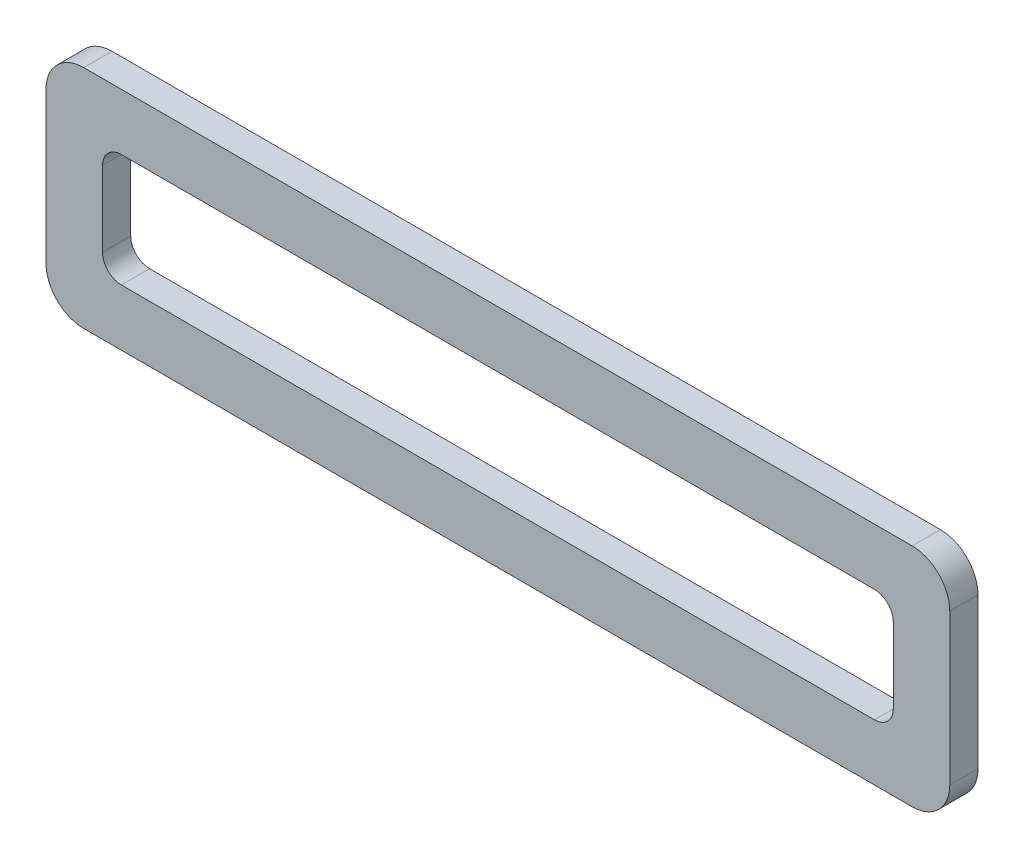
ISO-10303-21;
HEADER;
FILE_DESCRIPTION(('STEP AP214'),'2;1');
FILE_NAME('part.step','',(''),(''),'','','');
FILE_SCHEMA(('AUTOMOTIVE_DESIGN { 1 0 10303 214 1 1 1 1 }'));
ENDSEC;
DATA;
#1=APPLICATION_CONTEXT('core data for automotive mechanical design processes');
#2=APPLICATION_PROTOCOL_DEFINITION('international standard','automotive_design',2000,#1);
#3=PRODUCT_CONTEXT('',#1,'mechanical');
#4=PRODUCT('Part','Part','',(#3));
#5=PRODUCT_RELATED_PRODUCT_CATEGORY('part','',(#4));
#6=PRODUCT_DEFINITION_FORMATION('','',#4);
#7=PRODUCT_DEFINITION_CONTEXT('part definition',#1,'design');
#8=PRODUCT_DEFINITION('design','',#6,#7);
#9=PRODUCT_DEFINITION_SHAPE('','',#8);
#10=(LENGTH_UNIT() NAMED_UNIT(*) SI_UNIT(.MILLI.,.METRE.));
#11=(NAMED_UNIT(*) PLANE_ANGLE_UNIT() SI_UNIT($,.RADIAN.));
#12=(NAMED_UNIT(*) SI_UNIT($,.STERADIAN.) SOLID_ANGLE_UNIT());
#13=UNCERTAINTY_MEASURE_WITH_UNIT(LENGTH_MEASURE(1.E-05),#10,'distance_accuracy_value','');
#14=(GEOMETRIC_REPRESENTATION_CONTEXT(3) GLOBAL_UNCERTAINTY_ASSIGNED_CONTEXT((#13)) GLOBAL_UNIT_ASSIGNED_CONTEXT((#10,
#11,#12)) REPRESENTATION_CONTEXT('',''));
#15=CARTESIAN_POINT('',(0.,0.,0.));
#16=DIRECTION('',(0.,0.,1.));
#17=DIRECTION('',(1.,0.,0.));
#18=AXIS2_PLACEMENT_3D('',#15,#16,#17);
#19=CARTESIAN_POINT('',(0.,0.,9.525));
#20=DIRECTION('',(0.,0.,1.));
#21=DIRECTION('',(1.,0.,0.));
#22=AXIS2_PLACEMENT_3D('',#19,#20,#21);
#23=PLANE('',#22);
#24=DIRECTION('',(0.,-1.,0.));
#25=VECTOR('',#24,1.);
#26=CARTESIAN_POINT('',(-152.4,38.1,9.525));
#27=LINE('',#26,#25);
#28=CARTESIAN_POINT('',(-152.4,25.4,9.525));
#29=VERTEX_POINT('',#28);
#30=CARTESIAN_POINT('',(-152.4,-25.4,9.525));
#31=VERTEX_POINT('',#30);
#32=EDGE_CURVE('E278',#29,#31,#27,.T.);
#33=ORIENTED_EDGE('',*,*,#32,.T.);
#34=CARTESIAN_POINT('',(-139.7,-25.4,9.525));
#35=DIRECTION('',(0.,0.,1.));
#36=DIRECTION('',(1.,0.,0.));
#37=AXIS2_PLACEMENT_3D('',#34,#35,#36);
#38=CIRCLE('',#37,12.7);
#39=CARTESIAN_POINT('',(-139.7,-38.1,9.525));
#40=VERTEX_POINT('',#39);
#41=EDGE_CURVE('E199',#31,#40,#38,.T.);
#42=ORIENTED_EDGE('',*,*,#41,.T.);
#43=DIRECTION('',(1.,0.,0.));
#44=VECTOR('',#43,1.);
#45=CARTESIAN_POINT('',(-152.4,-38.1,9.525));
#46=LINE('',#45,#44);
#47=CARTESIAN_POINT('',(139.7,-38.1,9.525));
#48=VERTEX_POINT('',#47);
#49=EDGE_CURVE('E168',#40,#48,#46,.T.);
#50=ORIENTED_EDGE('',*,*,#49,.T.);
#51=CARTESIAN_POINT('',(139.7,-25.4,9.525));
#52=DIRECTION('',(0.,0.,1.));
#53=DIRECTION('',(1.,0.,0.));
#54=AXIS2_PLACEMENT_3D('',#51,#52,#53);
#55=CIRCLE('',#54,12.7);
#56=CARTESIAN_POINT('',(152.4,-25.4,9.525));
#57=VERTEX_POINT('',#56);
#58=EDGE_CURVE('E197',#48,#57,#55,.T.);
#59=ORIENTED_EDGE('',*,*,#58,.T.);
#60=DIRECTION('',(0.,1.,0.));
#61=VECTOR('',#60,1.);
#62=CARTESIAN_POINT('',(152.4,38.1,9.525));
#63=LINE('',#62,#61);
#64=CARTESIAN_POINT('',(152.4,25.4,9.525));
#65=VERTEX_POINT('',#64);
#66=EDGE_CURVE('E175',#57,#65,#63,.T.);
#67=ORIENTED_EDGE('',*,*,#66,.T.);
#68=CARTESIAN_POINT('',(139.7,25.4,9.525));
#69=DIRECTION('',(0.,0.,1.));
#70=DIRECTION('',(1.,0.,0.));
#71=AXIS2_PLACEMENT_3D('',#68,#69,#70);
#72=CIRCLE('',#71,12.7);
#73=CARTESIAN_POINT('',(139.7,38.1,9.525));
#74=VERTEX_POINT('',#73);
#75=EDGE_CURVE('E195',#65,#74,#72,.T.);
#76=ORIENTED_EDGE('',*,*,#75,.T.);
#77=DIRECTION('',(-1.,0.,0.));
#78=VECTOR('',#77,1.);
#79=CARTESIAN_POINT('',(-152.4,38.1,9.525));
#80=LINE('',#79,#78);
#81=CARTESIAN_POINT('',(-139.7,38.1,9.525));
#82=VERTEX_POINT('',#81);
#83=EDGE_CURVE('E179',#74,#82,#80,.T.);
#84=ORIENTED_EDGE('',*,*,#83,.T.);
#85=CARTESIAN_POINT('',(-139.7,25.4,9.525));
#86=DIRECTION('',(0.,0.,1.));
#87=DIRECTION('',(1.,0.,0.));
#88=AXIS2_PLACEMENT_3D('',#85,#86,#87);
#89=CIRCLE('',#88,12.7);
#90=EDGE_CURVE('E193',#82,#29,#89,.T.);
#91=ORIENTED_EDGE('',*,*,#90,.T.);
#92=EDGE_LOOP('',(#33,#42,#50,#59,#67,#76,#84,#91));
#93=FACE_BOUND('',#92,.T.);
#94=DIRECTION('',(-1.,0.,0.));
#95=VECTOR('',#94,1.);
#96=CARTESIAN_POINT('',(-133.35,19.05,9.525));
#97=LINE('',#96,#95);
#98=CARTESIAN_POINT('',(127.,19.05,9.525));
#99=VERTEX_POINT('',#98);
#100=CARTESIAN_POINT('',(-127.,19.05,9.525));
#101=VERTEX_POINT('',#100);
#102=EDGE_CURVE('E255',#99,#101,#97,.T.);
#103=ORIENTED_EDGE('',*,*,#102,.F.);
#104=CARTESIAN_POINT('',(127.,12.7,9.525));
#105=DIRECTION('',(0.,0.,1.));
#106=DIRECTION('',(1.,0.,0.));
#107=AXIS2_PLACEMENT_3D('',#104,#105,#106);
#108=CIRCLE('',#107,6.35);
#109=CARTESIAN_POINT('',(133.35,12.7,9.525));
#110=VERTEX_POINT('',#109);
#111=EDGE_CURVE('E232',#99,#110,#108,.F.);
#112=ORIENTED_EDGE('',*,*,#111,.T.);
#113=DIRECTION('',(0.,1.,0.));
#114=VECTOR('',#113,1.);
#115=CARTESIAN_POINT('',(133.35,19.05,9.525));
#116=LINE('',#115,#114);
#117=CARTESIAN_POINT('',(133.35,-12.7,9.525));
#118=VERTEX_POINT('',#117);
#119=EDGE_CURVE('E261',#118,#110,#116,.T.);
#120=ORIENTED_EDGE('',*,*,#119,.F.);
#121=CARTESIAN_POINT('',(127.,-12.7,9.525));
#122=DIRECTION('',(0.,0.,1.));
#123=DIRECTION('',(1.,0.,0.));
#124=AXIS2_PLACEMENT_3D('',#121,#122,#123);
#125=CIRCLE('',#124,6.35);
#126=CARTESIAN_POINT('',(127.,-19.05,9.525));
#127=VERTEX_POINT('',#126);
#128=EDGE_CURVE('E236',#118,#127,#125,.F.);
#129=ORIENTED_EDGE('',*,*,#128,.T.);
#130=DIRECTION('',(1.,0.,0.));
#131=VECTOR('',#130,1.);
#132=CARTESIAN_POINT('',(-133.35,-19.05,9.525));
#133=LINE('',#132,#131);
#134=CARTESIAN_POINT('',(-127.,-19.05,9.525));
#135=VERTEX_POINT('',#134);
#136=EDGE_CURVE('E263',#135,#127,#133,.T.);
#137=ORIENTED_EDGE('',*,*,#136,.F.);
#138=CARTESIAN_POINT('',(-127.,-12.7,9.525));
#139=DIRECTION('',(0.,0.,1.));
#140=DIRECTION('',(1.,0.,0.));
#141=AXIS2_PLACEMENT_3D('',#138,#139,#140);
#142=CIRCLE('',#141,6.35);
#143=CARTESIAN_POINT('',(-133.35,-12.7,9.525));
#144=VERTEX_POINT('',#143);
#145=EDGE_CURVE('E49',#135,#144,#142,.F.);
#146=ORIENTED_EDGE('',*,*,#145,.T.);
#147=DIRECTION('',(0.,-1.,0.));
#148=VECTOR('',#147,1.);
#149=CARTESIAN_POINT('',(-133.35,19.05,9.525));
#150=LINE('',#149,#148);
#151=CARTESIAN_POINT('',(-133.35,12.7,9.525));
#152=VERTEX_POINT('',#151);
#153=EDGE_CURVE('E257',#152,#144,#150,.T.);
#154=ORIENTED_EDGE('',*,*,#153,.F.);
#155=CARTESIAN_POINT('',(-127.,12.7,9.525));
#156=DIRECTION('',(0.,0.,1.));
#157=DIRECTION('',(1.,0.,0.));
#158=AXIS2_PLACEMENT_3D('',#155,#156,#157);
#159=CIRCLE('',#158,6.35);
#160=EDGE_CURVE('E11',#152,#101,#159,.F.);
#161=ORIENTED_EDGE('',*,*,#160,.T.);
#162=EDGE_LOOP('',(#103,#112,#120,#129,#137,#146,#154,#161));
#163=FACE_BOUND('',#162,.T.);
#164=ADVANCED_FACE('F34',(#93,#163),#23,.T.);
#165=CARTESIAN_POINT('',(0.,0.,0.));
#166=DIRECTION('',(0.,0.,1.));
#167=DIRECTION('',(1.,0.,0.));
#168=AXIS2_PLACEMENT_3D('',#165,#166,#167);
#169=PLANE('',#168);
#170=DIRECTION('',(1.,0.,0.));
#171=VECTOR('',#170,1.);
#172=CARTESIAN_POINT('',(-152.4,-38.1,0.));
#173=LINE('',#172,#171);
#174=CARTESIAN_POINT('',(-139.7,-38.1,0.));
#175=VERTEX_POINT('',#174);
#176=CARTESIAN_POINT('',(139.7,-38.1,0.));
#177=VERTEX_POINT('',#176);
#178=EDGE_CURVE('E165',#175,#177,#173,.T.);
#179=ORIENTED_EDGE('',*,*,#178,.F.);
#180=CARTESIAN_POINT('',(-139.7,-25.4,0.));
#181=DIRECTION('',(0.,0.,1.));
#182=DIRECTION('',(1.,0.,0.));
#183=AXIS2_PLACEMENT_3D('',#180,#181,#182);
#184=CIRCLE('',#183,12.7);
#185=CARTESIAN_POINT('',(-152.4,-25.4,0.));
#186=VERTEX_POINT('',#185);
#187=EDGE_CURVE('E148',#175,#186,#184,.F.);
#188=ORIENTED_EDGE('',*,*,#187,.T.);
#189=DIRECTION('',(0.,-1.,0.));
#190=VECTOR('',#189,1.);
#191=CARTESIAN_POINT('',(-152.4,38.1,0.));
#192=LINE('',#191,#190);
#193=CARTESIAN_POINT('',(-152.4,25.4,0.));
#194=VERTEX_POINT('',#193);
#195=EDGE_CURVE('E176',#194,#186,#192,.T.);
#196=ORIENTED_EDGE('',*,*,#195,.F.);
#197=CARTESIAN_POINT('',(-139.7,25.4,0.));
#198=DIRECTION('',(0.,0.,1.));
#199=DIRECTION('',(1.,0.,0.));
#200=AXIS2_PLACEMENT_3D('',#197,#198,#199);
#201=CIRCLE('',#200,12.7);
#202=CARTESIAN_POINT('',(-139.7,38.1,0.));
#203=VERTEX_POINT('',#202);
#204=EDGE_CURVE('E169',#194,#203,#201,.F.);
#205=ORIENTED_EDGE('',*,*,#204,.T.);
#206=DIRECTION('',(-1.,0.,0.));
#207=VECTOR('',#206,1.);
#208=CARTESIAN_POINT('',(-152.4,38.1,0.));
#209=LINE('',#208,#207);
#210=CARTESIAN_POINT('',(139.7,38.1,0.));
#211=VERTEX_POINT('',#210);
#212=EDGE_CURVE('E181',#211,#203,#209,.T.);
#213=ORIENTED_EDGE('',*,*,#212,.F.);
#214=CARTESIAN_POINT('',(139.7,25.4,0.));
#215=DIRECTION('',(0.,0.,1.));
#216=DIRECTION('',(1.,0.,0.));
#217=AXIS2_PLACEMENT_3D('',#214,#215,#216);
#218=CIRCLE('',#217,12.7);
#219=CARTESIAN_POINT('',(152.4,25.4,0.));
#220=VERTEX_POINT('',#219);
#221=EDGE_CURVE('E187',#211,#220,#218,.F.);
#222=ORIENTED_EDGE('',*,*,#221,.T.);
#223=DIRECTION('',(0.,1.,0.));
#224=VECTOR('',#223,1.);
#225=CARTESIAN_POINT('',(152.4,38.1,0.));
#226=LINE('',#225,#224);
#227=CARTESIAN_POINT('',(152.4,-25.4,0.));
#228=VERTEX_POINT('',#227);
#229=EDGE_CURVE('E270',#228,#220,#226,.T.);
#230=ORIENTED_EDGE('',*,*,#229,.F.);
#231=CARTESIAN_POINT('',(139.7,-25.4,0.));
#232=DIRECTION('',(0.,0.,1.));
#233=DIRECTION('',(1.,0.,0.));
#234=AXIS2_PLACEMENT_3D('',#231,#232,#233);
#235=CIRCLE('',#234,12.7);
#236=EDGE_CURVE('E159',#228,#177,#235,.F.);
#237=ORIENTED_EDGE('',*,*,#236,.T.);
#238=EDGE_LOOP('',(#179,#188,#196,#205,#213,#222,#230,#237));
#239=FACE_BOUND('',#238,.T.);
#240=DIRECTION('',(1.,0.,0.));
#241=VECTOR('',#240,1.);
#242=CARTESIAN_POINT('',(-133.35,-19.05,0.));
#243=LINE('',#242,#241);
#244=CARTESIAN_POINT('',(-127.,-19.05,0.));
#245=VERTEX_POINT('',#244);
#246=CARTESIAN_POINT('',(127.,-19.05,0.));
#247=VERTEX_POINT('',#246);
#248=EDGE_CURVE('E250',#245,#247,#243,.T.);
#249=ORIENTED_EDGE('',*,*,#248,.T.);
#250=CARTESIAN_POINT('',(127.,-12.7,0.));
#251=DIRECTION('',(0.,0.,1.));
#252=DIRECTION('',(1.,0.,0.));
#253=AXIS2_PLACEMENT_3D('',#250,#251,#252);
#254=CIRCLE('',#253,6.35);
#255=CARTESIAN_POINT('',(133.35,-12.7,0.));
#256=VERTEX_POINT('',#255);
#257=EDGE_CURVE('E234',#247,#256,#254,.T.);
#258=ORIENTED_EDGE('',*,*,#257,.T.);
#259=DIRECTION('',(0.,1.,0.));
#260=VECTOR('',#259,1.);
#261=CARTESIAN_POINT('',(133.35,19.05,0.));
#262=LINE('',#261,#260);
#263=CARTESIAN_POINT('',(133.35,12.7,0.));
#264=VERTEX_POINT('',#263);
#265=EDGE_CURVE('E271',#256,#264,#262,.T.);
#266=ORIENTED_EDGE('',*,*,#265,.T.);
#267=CARTESIAN_POINT('',(127.,12.7,0.));
#268=DIRECTION('',(0.,0.,1.));
#269=DIRECTION('',(1.,0.,0.));
#270=AXIS2_PLACEMENT_3D('',#267,#268,#269);
#271=CIRCLE('',#270,6.35);
#272=CARTESIAN_POINT('',(127.,19.05,0.));
#273=VERTEX_POINT('',#272);
#274=EDGE_CURVE('E230',#264,#273,#271,.T.);
#275=ORIENTED_EDGE('',*,*,#274,.T.);
#276=DIRECTION('',(-1.,0.,0.));
#277=VECTOR('',#276,1.);
#278=CARTESIAN_POINT('',(-133.35,19.05,0.));
#279=LINE('',#278,#277);
#280=CARTESIAN_POINT('',(-127.,19.05,0.));
#281=VERTEX_POINT('',#280);
#282=EDGE_CURVE('E245',#273,#281,#279,.T.);
#283=ORIENTED_EDGE('',*,*,#282,.T.);
#284=CARTESIAN_POINT('',(-127.,12.7,0.));
#285=DIRECTION('',(0.,0.,1.));
#286=DIRECTION('',(1.,0.,0.));
#287=AXIS2_PLACEMENT_3D('',#284,#285,#286);
#288=CIRCLE('',#287,6.35);
#289=CARTESIAN_POINT('',(-133.35,12.7,0.));
#290=VERTEX_POINT('',#289);
#291=EDGE_CURVE('E42',#281,#290,#288,.T.);
#292=ORIENTED_EDGE('',*,*,#291,.T.);
#293=DIRECTION('',(0.,-1.,0.));
#294=VECTOR('',#293,1.);
#295=CARTESIAN_POINT('',(-133.35,19.05,0.));
#296=LINE('',#295,#294);
#297=CARTESIAN_POINT('',(-133.35,-12.7,0.));
#298=VERTEX_POINT('',#297);
#299=EDGE_CURVE('E243',#290,#298,#296,.T.);
#300=ORIENTED_EDGE('',*,*,#299,.T.);
#301=CARTESIAN_POINT('',(-127.,-12.7,0.));
#302=DIRECTION('',(0.,0.,1.));
#303=DIRECTION('',(1.,0.,0.));
#304=AXIS2_PLACEMENT_3D('',#301,#302,#303);
#305=CIRCLE('',#304,6.35);
#306=EDGE_CURVE('E238',#298,#245,#305,.T.);
#307=ORIENTED_EDGE('',*,*,#306,.T.);
#308=EDGE_LOOP('',(#249,#258,#266,#275,#283,#292,#300,#307));
#309=FACE_BOUND('',#308,.T.);
#310=ADVANCED_FACE('F172',(#239,#309),#169,.F.);
#311=CARTESIAN_POINT('',(152.4,38.1,9.525));
#312=DIRECTION('',(-1.,0.,0.));
#313=DIRECTION('',(0.,0.,1.));
#314=AXIS2_PLACEMENT_3D('',#311,#312,#313);
#315=PLANE('',#314);
#316=ORIENTED_EDGE('',*,*,#66,.F.);
#317=DIRECTION('',(0.,0.,-1.));
#318=VECTOR('',#317,1.);
#319=CARTESIAN_POINT('',(152.4,-25.4,9.525));
#320=LINE('',#319,#318);
#321=EDGE_CURVE('E203',#57,#228,#320,.T.);
#322=ORIENTED_EDGE('',*,*,#321,.T.);
#323=ORIENTED_EDGE('',*,*,#229,.T.);
#324=DIRECTION('',(0.,0.,-1.));
#325=VECTOR('',#324,1.);
#326=CARTESIAN_POINT('',(152.4,25.4,9.525));
#327=LINE('',#326,#325);
#328=EDGE_CURVE('E201',#220,#65,#327,.F.);
#329=ORIENTED_EDGE('',*,*,#328,.T.);
#330=EDGE_LOOP('',(#316,#322,#323,#329));
#331=FACE_BOUND('',#330,.T.);
#332=ADVANCED_FACE('F306',(#331),#315,.F.);
#333=CARTESIAN_POINT('',(-152.4,38.1,9.525));
#334=DIRECTION('',(0.,-1.,0.));
#335=DIRECTION('',(0.,0.,-1.));
#336=AXIS2_PLACEMENT_3D('',#333,#334,#335);
#337=PLANE('',#336);
#338=ORIENTED_EDGE('',*,*,#83,.F.);
#339=DIRECTION('',(0.,0.,-1.));
#340=VECTOR('',#339,1.);
#341=CARTESIAN_POINT('',(139.7,38.1,9.525));
#342=LINE('',#341,#340);
#343=EDGE_CURVE('E208',#74,#211,#342,.T.);
#344=ORIENTED_EDGE('',*,*,#343,.T.);
#345=ORIENTED_EDGE('',*,*,#212,.T.);
#346=DIRECTION('',(0.,0.,-1.));
#347=VECTOR('',#346,1.);
#348=CARTESIAN_POINT('',(-139.7,38.1,9.525));
#349=LINE('',#348,#347);
#350=EDGE_CURVE('E206',#203,#82,#349,.F.);
#351=ORIENTED_EDGE('',*,*,#350,.T.);
#352=EDGE_LOOP('',(#338,#344,#345,#351));
#353=FACE_BOUND('',#352,.T.);
#354=ADVANCED_FACE('F288',(#353),#337,.F.);
#355=CARTESIAN_POINT('',(-152.4,38.1,9.525));
#356=DIRECTION('',(1.,0.,0.));
#357=DIRECTION('',(0.,0.,-1.));
#358=AXIS2_PLACEMENT_3D('',#355,#356,#357);
#359=PLANE('',#358);
#360=ORIENTED_EDGE('',*,*,#195,.T.);
#361=DIRECTION('',(0.,0.,-1.));
#362=VECTOR('',#361,1.);
#363=CARTESIAN_POINT('',(-152.4,-25.4,9.525));
#364=LINE('',#363,#362);
#365=EDGE_CURVE('E153',#186,#31,#364,.F.);
#366=ORIENTED_EDGE('',*,*,#365,.T.);
#367=ORIENTED_EDGE('',*,*,#32,.F.);
#368=DIRECTION('',(0.,0.,-1.));
#369=VECTOR('',#368,1.);
#370=CARTESIAN_POINT('',(-152.4,25.4,9.525));
#371=LINE('',#370,#369);
#372=EDGE_CURVE('E158',#29,#194,#371,.T.);
#373=ORIENTED_EDGE('',*,*,#372,.T.);
#374=EDGE_LOOP('',(#360,#366,#367,#373));
#375=FACE_BOUND('',#374,.T.);
#376=ADVANCED_FACE('F297',(#375),#359,.F.);
#377=CARTESIAN_POINT('',(-152.4,-38.1,9.525));
#378=DIRECTION('',(0.,1.,0.));
#379=DIRECTION('',(0.,0.,1.));
#380=AXIS2_PLACEMENT_3D('',#377,#378,#379);
#381=PLANE('',#380);
#382=ORIENTED_EDGE('',*,*,#49,.F.);
#383=DIRECTION('',(0.,0.,-1.));
#384=VECTOR('',#383,1.);
#385=CARTESIAN_POINT('',(-139.7,-38.1,9.525));
#386=LINE('',#385,#384);
#387=EDGE_CURVE('E152',#40,#175,#386,.T.);
#388=ORIENTED_EDGE('',*,*,#387,.T.);
#389=ORIENTED_EDGE('',*,*,#178,.T.);
#390=DIRECTION('',(0.,0.,-1.));
#391=VECTOR('',#390,1.);
#392=CARTESIAN_POINT('',(139.7,-38.1,9.525));
#393=LINE('',#392,#391);
#394=EDGE_CURVE('E170',#177,#48,#393,.F.);
#395=ORIENTED_EDGE('',*,*,#394,.T.);
#396=EDGE_LOOP('',(#382,#388,#389,#395));
#397=FACE_BOUND('',#396,.T.);
#398=ADVANCED_FACE('F164',(#397),#381,.F.);
#399=CARTESIAN_POINT('',(133.35,19.05,9.525));
#400=DIRECTION('',(-1.,0.,0.));
#401=DIRECTION('',(0.,0.,1.));
#402=AXIS2_PLACEMENT_3D('',#399,#400,#401);
#403=PLANE('',#402);
#404=ORIENTED_EDGE('',*,*,#119,.T.);
#405=DIRECTION('',(0.,0.,-1.));
#406=VECTOR('',#405,1.);
#407=CARTESIAN_POINT('',(133.35,12.7,0.));
#408=LINE('',#407,#406);
#409=EDGE_CURVE('E213',#110,#264,#408,.T.);
#410=ORIENTED_EDGE('',*,*,#409,.T.);
#411=ORIENTED_EDGE('',*,*,#265,.F.);
#412=DIRECTION('',(0.,0.,-1.));
#413=VECTOR('',#412,1.);
#414=CARTESIAN_POINT('',(133.35,-12.7,9.525));
#415=LINE('',#414,#413);
#416=EDGE_CURVE('E211',#256,#118,#415,.F.);
#417=ORIENTED_EDGE('',*,*,#416,.T.);
#418=EDGE_LOOP('',(#404,#410,#411,#417));
#419=FACE_BOUND('',#418,.T.);
#420=ADVANCED_FACE('F304',(#419),#403,.T.);
#421=CARTESIAN_POINT('',(-133.35,19.05,9.525));
#422=DIRECTION('',(0.,-1.,0.));
#423=DIRECTION('',(0.,0.,-1.));
#424=AXIS2_PLACEMENT_3D('',#421,#422,#423);
#425=PLANE('',#424);
#426=ORIENTED_EDGE('',*,*,#282,.F.);
#427=DIRECTION('',(0.,0.,-1.));
#428=VECTOR('',#427,1.);
#429=CARTESIAN_POINT('',(127.,19.05,9.525));
#430=LINE('',#429,#428);
#431=EDGE_CURVE('E219',#273,#99,#430,.F.);
#432=ORIENTED_EDGE('',*,*,#431,.T.);
#433=ORIENTED_EDGE('',*,*,#102,.T.);
#434=DIRECTION('',(0.,0.,-1.));
#435=VECTOR('',#434,1.);
#436=CARTESIAN_POINT('',(-127.,19.05,0.));
#437=LINE('',#436,#435);
#438=EDGE_CURVE('E216',#101,#281,#437,.T.);
#439=ORIENTED_EDGE('',*,*,#438,.T.);
#440=EDGE_LOOP('',(#426,#432,#433,#439));
#441=FACE_BOUND('',#440,.T.);
#442=ADVANCED_FACE('F259',(#441),#425,.T.);
#443=CARTESIAN_POINT('',(-133.35,19.05,9.525));
#444=DIRECTION('',(1.,0.,0.));
#445=DIRECTION('',(0.,0.,-1.));
#446=AXIS2_PLACEMENT_3D('',#443,#444,#445);
#447=PLANE('',#446);
#448=ORIENTED_EDGE('',*,*,#153,.T.);
#449=DIRECTION('',(0.,0.,-1.));
#450=VECTOR('',#449,1.);
#451=CARTESIAN_POINT('',(-133.35,-12.7,0.));
#452=LINE('',#451,#450);
#453=EDGE_CURVE('E227',#144,#298,#452,.T.);
#454=ORIENTED_EDGE('',*,*,#453,.T.);
#455=ORIENTED_EDGE('',*,*,#299,.F.);
#456=DIRECTION('',(0.,0.,-1.));
#457=VECTOR('',#456,1.);
#458=CARTESIAN_POINT('',(-133.35,12.7,9.525));
#459=LINE('',#458,#457);
#460=EDGE_CURVE('E56',#290,#152,#459,.F.);
#461=ORIENTED_EDGE('',*,*,#460,.T.);
#462=EDGE_LOOP('',(#448,#454,#455,#461));
#463=FACE_BOUND('',#462,.T.);
#464=ADVANCED_FACE('F248',(#463),#447,.T.);
#465=CARTESIAN_POINT('',(-133.35,-19.05,9.525));
#466=DIRECTION('',(0.,1.,0.));
#467=DIRECTION('',(0.,0.,1.));
#468=AXIS2_PLACEMENT_3D('',#465,#466,#467);
#469=PLANE('',#468);
#470=ORIENTED_EDGE('',*,*,#136,.T.);
#471=DIRECTION('',(0.,0.,-1.));
#472=VECTOR('',#471,1.);
#473=CARTESIAN_POINT('',(127.,-19.05,0.));
#474=LINE('',#473,#472);
#475=EDGE_CURVE('E223',#127,#247,#474,.T.);
#476=ORIENTED_EDGE('',*,*,#475,.T.);
#477=ORIENTED_EDGE('',*,*,#248,.F.);
#478=DIRECTION('',(0.,0.,-1.));
#479=VECTOR('',#478,1.);
#480=CARTESIAN_POINT('',(-127.,-19.05,9.525));
#481=LINE('',#480,#479);
#482=EDGE_CURVE('E221',#245,#135,#481,.F.);
#483=ORIENTED_EDGE('',*,*,#482,.T.);
#484=EDGE_LOOP('',(#470,#476,#477,#483));
#485=FACE_BOUND('',#484,.T.);
#486=ADVANCED_FACE('F322',(#485),#469,.T.);
#487=CARTESIAN_POINT('',(-139.7,-25.4,9.525));
#488=DIRECTION('',(0.,0.,-1.));
#489=DIRECTION('',(-1.,0.,0.));
#490=AXIS2_PLACEMENT_3D('',#487,#488,#489);
#491=CYLINDRICAL_SURFACE('',#490,12.7);
#492=ORIENTED_EDGE('',*,*,#41,.F.);
#493=ORIENTED_EDGE('',*,*,#365,.F.);
#494=ORIENTED_EDGE('',*,*,#187,.F.);
#495=ORIENTED_EDGE('',*,*,#387,.F.);
#496=EDGE_LOOP('',(#492,#493,#494,#495));
#497=FACE_BOUND('',#496,.T.);
#498=ADVANCED_FACE('F151',(#497),#491,.T.);
#499=CARTESIAN_POINT('',(139.7,-25.4,9.525));
#500=DIRECTION('',(0.,0.,-1.));
#501=DIRECTION('',(-1.,0.,0.));
#502=AXIS2_PLACEMENT_3D('',#499,#500,#501);
#503=CYLINDRICAL_SURFACE('',#502,12.7);
#504=ORIENTED_EDGE('',*,*,#58,.F.);
#505=ORIENTED_EDGE('',*,*,#394,.F.);
#506=ORIENTED_EDGE('',*,*,#236,.F.);
#507=ORIENTED_EDGE('',*,*,#321,.F.);
#508=EDGE_LOOP('',(#504,#505,#506,#507));
#509=FACE_BOUND('',#508,.T.);
#510=ADVANCED_FACE('F328',(#509),#503,.T.);
#511=CARTESIAN_POINT('',(139.7,25.4,9.525));
#512=DIRECTION('',(0.,0.,-1.));
#513=DIRECTION('',(-1.,0.,0.));
#514=AXIS2_PLACEMENT_3D('',#511,#512,#513);
#515=CYLINDRICAL_SURFACE('',#514,12.7);
#516=ORIENTED_EDGE('',*,*,#75,.F.);
#517=ORIENTED_EDGE('',*,*,#328,.F.);
#518=ORIENTED_EDGE('',*,*,#221,.F.);
#519=ORIENTED_EDGE('',*,*,#343,.F.);
#520=EDGE_LOOP('',(#516,#517,#518,#519));
#521=FACE_BOUND('',#520,.T.);
#522=ADVANCED_FACE('F350',(#521),#515,.T.);
#523=CARTESIAN_POINT('',(-139.7,25.4,9.525));
#524=DIRECTION('',(0.,0.,-1.));
#525=DIRECTION('',(-1.,0.,0.));
#526=AXIS2_PLACEMENT_3D('',#523,#524,#525);
#527=CYLINDRICAL_SURFACE('',#526,12.7);
#528=ORIENTED_EDGE('',*,*,#90,.F.);
#529=ORIENTED_EDGE('',*,*,#350,.F.);
#530=ORIENTED_EDGE('',*,*,#204,.F.);
#531=ORIENTED_EDGE('',*,*,#372,.F.);
#532=EDGE_LOOP('',(#528,#529,#530,#531));
#533=FACE_BOUND('',#532,.T.);
#534=ADVANCED_FACE('F292',(#533),#527,.T.);
#535=CARTESIAN_POINT('',(127.,12.7,9.525));
#536=DIRECTION('',(0.,0.,1.));
#537=DIRECTION('',(1.,0.,0.));
#538=AXIS2_PLACEMENT_3D('',#535,#536,#537);
#539=CYLINDRICAL_SURFACE('',#538,6.35);
#540=ORIENTED_EDGE('',*,*,#111,.F.);
#541=ORIENTED_EDGE('',*,*,#431,.F.);
#542=ORIENTED_EDGE('',*,*,#274,.F.);
#543=ORIENTED_EDGE('',*,*,#409,.F.);
#544=EDGE_LOOP('',(#540,#541,#542,#543));
#545=FACE_BOUND('',#544,.T.);
#546=ADVANCED_FACE('F341',(#545),#539,.F.);
#547=CARTESIAN_POINT('',(127.,-12.7,9.525));
#548=DIRECTION('',(0.,0.,1.));
#549=DIRECTION('',(1.,0.,0.));
#550=AXIS2_PLACEMENT_3D('',#547,#548,#549);
#551=CYLINDRICAL_SURFACE('',#550,6.35);
#552=ORIENTED_EDGE('',*,*,#128,.F.);
#553=ORIENTED_EDGE('',*,*,#416,.F.);
#554=ORIENTED_EDGE('',*,*,#257,.F.);
#555=ORIENTED_EDGE('',*,*,#475,.F.);
#556=EDGE_LOOP('',(#552,#553,#554,#555));
#557=FACE_BOUND('',#556,.T.);
#558=ADVANCED_FACE('F335',(#557),#551,.F.);
#559=CARTESIAN_POINT('',(-127.,-12.7,9.525));
#560=DIRECTION('',(0.,0.,1.));
#561=DIRECTION('',(1.,0.,0.));
#562=AXIS2_PLACEMENT_3D('',#559,#560,#561);
#563=CYLINDRICAL_SURFACE('',#562,6.35);
#564=ORIENTED_EDGE('',*,*,#145,.F.);
#565=ORIENTED_EDGE('',*,*,#482,.F.);
#566=ORIENTED_EDGE('',*,*,#306,.F.);
#567=ORIENTED_EDGE('',*,*,#453,.F.);
#568=EDGE_LOOP('',(#564,#565,#566,#567));
#569=FACE_BOUND('',#568,.T.);
#570=ADVANCED_FACE('F348',(#569),#563,.F.);
#571=CARTESIAN_POINT('',(-127.,12.7,9.525));
#572=DIRECTION('',(0.,0.,1.));
#573=DIRECTION('',(1.,0.,0.));
#574=AXIS2_PLACEMENT_3D('',#571,#572,#573);
#575=CYLINDRICAL_SURFACE('',#574,6.35);
#576=ORIENTED_EDGE('',*,*,#160,.F.);
#577=ORIENTED_EDGE('',*,*,#460,.F.);
#578=ORIENTED_EDGE('',*,*,#291,.F.);
#579=ORIENTED_EDGE('',*,*,#438,.F.);
#580=EDGE_LOOP('',(#576,#577,#578,#579));
#581=FACE_BOUND('',#580,.T.);
#582=ADVANCED_FACE('F36',(#581),#575,.F.);
#583=CLOSED_SHELL('',(#164,#310,#332,#354,#376,#398,#420,#442,#464,#486,#498,#510,#522,#534,
#546,#558,#570,#582));
#584=MANIFOLD_SOLID_BREP('B2',#583);
#585=ADVANCED_BREP_SHAPE_REPRESENTATION('',(#18,#584),#14);
#586=SHAPE_DEFINITION_REPRESENTATION(#9,#585);
ENDSEC;
END-ISO-10303-21;
